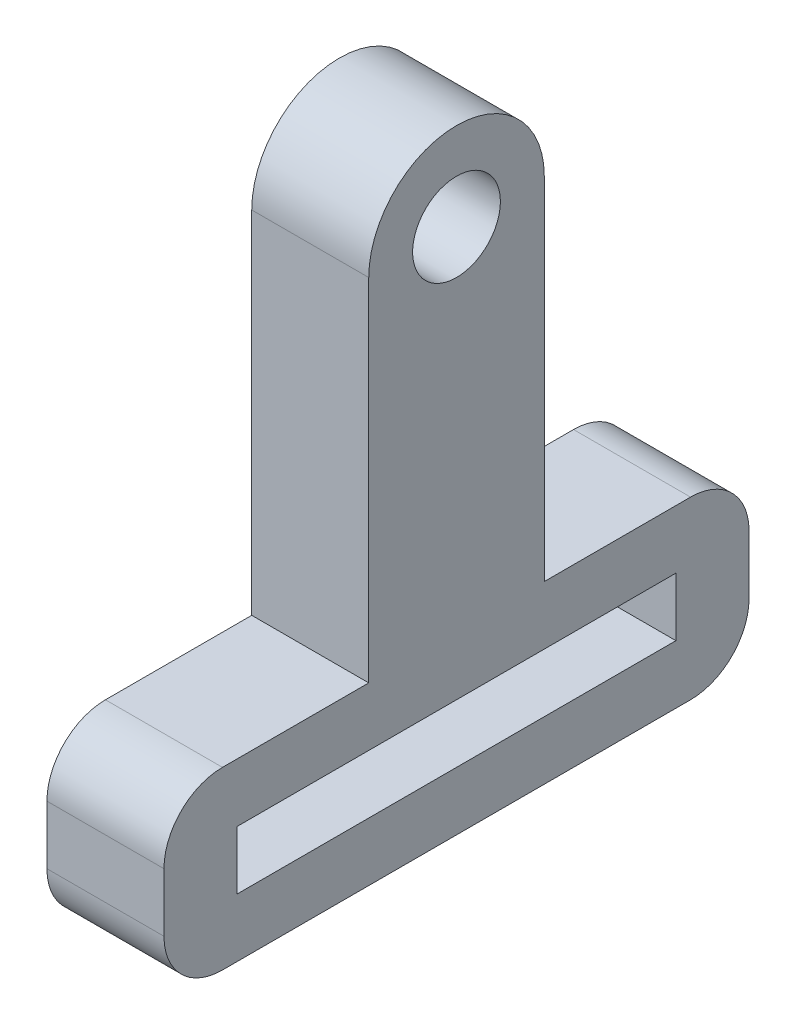
ISO-10303-21;
HEADER;
FILE_DESCRIPTION(('STEP AP214'),'2;1');
FILE_NAME('part.step','',(''),(''),'','','');
FILE_SCHEMA(('AUTOMOTIVE_DESIGN { 1 0 10303 214 1 1 1 1 }'));
ENDSEC;
DATA;
#1=APPLICATION_CONTEXT('core data for automotive mechanical design processes');
#2=APPLICATION_PROTOCOL_DEFINITION('international standard','automotive_design',2000,#1);
#3=PRODUCT_CONTEXT('',#1,'mechanical');
#4=PRODUCT('Part','Part','',(#3));
#5=PRODUCT_RELATED_PRODUCT_CATEGORY('part','',(#4));
#6=PRODUCT_DEFINITION_FORMATION('','',#4);
#7=PRODUCT_DEFINITION_CONTEXT('part definition',#1,'design');
#8=PRODUCT_DEFINITION('design','',#6,#7);
#9=PRODUCT_DEFINITION_SHAPE('','',#8);
#10=(LENGTH_UNIT() NAMED_UNIT(*) SI_UNIT(.MILLI.,.METRE.));
#11=(NAMED_UNIT(*) PLANE_ANGLE_UNIT() SI_UNIT($,.RADIAN.));
#12=(NAMED_UNIT(*) SI_UNIT($,.STERADIAN.) SOLID_ANGLE_UNIT());
#13=UNCERTAINTY_MEASURE_WITH_UNIT(LENGTH_MEASURE(1.E-05),#10,'distance_accuracy_value','');
#14=(GEOMETRIC_REPRESENTATION_CONTEXT(3) GLOBAL_UNCERTAINTY_ASSIGNED_CONTEXT((#13)) GLOBAL_UNIT_ASSIGNED_CONTEXT((#10,
#11,#12)) REPRESENTATION_CONTEXT('',''));
#15=CARTESIAN_POINT('',(0.,0.,0.));
#16=DIRECTION('',(0.,0.,1.));
#17=DIRECTION('',(1.,0.,0.));
#18=AXIS2_PLACEMENT_3D('',#15,#16,#17);
#19=CARTESIAN_POINT('',(2.,-1.,-8.));
#20=DIRECTION('',(1.,0.,0.));
#21=DIRECTION('',(0.,0.,-1.));
#22=AXIS2_PLACEMENT_3D('',#19,#20,#21);
#23=PLANE('',#22);
#24=DIRECTION('',(0.,0.,1.));
#25=VECTOR('',#24,1.);
#26=CARTESIAN_POINT('',(2.,1.,7.5));
#27=LINE('',#26,#25);
#28=CARTESIAN_POINT('',(2.,1.,-7.5));
#29=VERTEX_POINT('',#28);
#30=CARTESIAN_POINT('',(2.,1.,7.5));
#31=VERTEX_POINT('',#30);
#32=EDGE_CURVE('E154',#29,#31,#27,.T.);
#33=ORIENTED_EDGE('',*,*,#32,.F.);
#34=DIRECTION('',(0.,1.,0.));
#35=VECTOR('',#34,1.);
#36=CARTESIAN_POINT('',(2.,1.,-7.5));
#37=LINE('',#36,#35);
#38=CARTESIAN_POINT('',(2.,-1.,-7.5));
#39=VERTEX_POINT('',#38);
#40=EDGE_CURVE('E146',#39,#29,#37,.T.);
#41=ORIENTED_EDGE('',*,*,#40,.F.);
#42=DIRECTION('',(0.,0.,-1.));
#43=VECTOR('',#42,1.);
#44=CARTESIAN_POINT('',(2.,-1.,7.5));
#45=LINE('',#44,#43);
#46=CARTESIAN_POINT('',(2.,-1.,7.5));
#47=VERTEX_POINT('',#46);
#48=EDGE_CURVE('E169',#47,#39,#45,.T.);
#49=ORIENTED_EDGE('',*,*,#48,.F.);
#50=DIRECTION('',(0.,-1.,0.));
#51=VECTOR('',#50,1.);
#52=CARTESIAN_POINT('',(2.,1.,7.5));
#53=LINE('',#52,#51);
#54=EDGE_CURVE('E167',#31,#47,#53,.T.);
#55=ORIENTED_EDGE('',*,*,#54,.F.);
#56=EDGE_LOOP('',(#33,#41,#49,#55));
#57=FACE_BOUND('',#56,.T.);
#58=CARTESIAN_POINT('',(2.,-1.,-8.));
#59=DIRECTION('',(1.,0.,0.));
#60=DIRECTION('',(0.,0.,-1.));
#61=AXIS2_PLACEMENT_3D('',#58,#59,#60);
#62=CIRCLE('',#61,2.);
#63=CARTESIAN_POINT('',(2.,-3.,-7.99999999999998));
#64=VERTEX_POINT('',#63);
#65=CARTESIAN_POINT('',(2.,-0.999999999999986,-10.));
#66=VERTEX_POINT('',#65);
#67=EDGE_CURVE('E185',#64,#66,#62,.T.);
#68=ORIENTED_EDGE('',*,*,#67,.T.);
#69=DIRECTION('',(0.,1.,0.));
#70=VECTOR('',#69,1.);
#71=CARTESIAN_POINT('',(2.,0.999999999999986,-10.));
#72=LINE('',#71,#70);
#73=CARTESIAN_POINT('',(2.,0.999999999999987,-10.));
#74=VERTEX_POINT('',#73);
#75=EDGE_CURVE('E188',#66,#74,#72,.T.);
#76=ORIENTED_EDGE('',*,*,#75,.T.);
#77=CARTESIAN_POINT('',(2.,1.,-8.));
#78=DIRECTION('',(1.,0.,0.));
#79=DIRECTION('',(0.,0.,1.));
#80=AXIS2_PLACEMENT_3D('',#77,#78,#79);
#81=CIRCLE('',#80,2.);
#82=CARTESIAN_POINT('',(2.,3.,-7.99999999999998));
#83=VERTEX_POINT('',#82);
#84=EDGE_CURVE('E191',#74,#83,#81,.T.);
#85=ORIENTED_EDGE('',*,*,#84,.T.);
#86=DIRECTION('',(0.,0.,1.));
#87=VECTOR('',#86,1.);
#88=CARTESIAN_POINT('',(2.,3.,-3.));
#89=LINE('',#88,#87);
#90=CARTESIAN_POINT('',(2.,3.,-3.));
#91=VERTEX_POINT('',#90);
#92=EDGE_CURVE('E193',#83,#91,#89,.T.);
#93=ORIENTED_EDGE('',*,*,#92,.T.);
#94=DIRECTION('',(0.,1.,0.));
#95=VECTOR('',#94,1.);
#96=CARTESIAN_POINT('',(2.,15.,-3.));
#97=LINE('',#96,#95);
#98=CARTESIAN_POINT('',(2.,15.,-3.));
#99=VERTEX_POINT('',#98);
#100=EDGE_CURVE('E195',#91,#99,#97,.T.);
#101=ORIENTED_EDGE('',*,*,#100,.T.);
#102=CARTESIAN_POINT('',(2.,15.,0.));
#103=DIRECTION('',(1.,0.,0.));
#104=DIRECTION('',(0.,0.,-1.));
#105=AXIS2_PLACEMENT_3D('',#102,#103,#104);
#106=CIRCLE('',#105,3.);
#107=CARTESIAN_POINT('',(2.,15.,3.));
#108=VERTEX_POINT('',#107);
#109=EDGE_CURVE('E197',#99,#108,#106,.T.);
#110=ORIENTED_EDGE('',*,*,#109,.T.);
#111=DIRECTION('',(0.,-1.,0.));
#112=VECTOR('',#111,1.);
#113=CARTESIAN_POINT('',(2.,15.,3.));
#114=LINE('',#113,#112);
#115=CARTESIAN_POINT('',(2.,3.,3.));
#116=VERTEX_POINT('',#115);
#117=EDGE_CURVE('E199',#108,#116,#114,.T.);
#118=ORIENTED_EDGE('',*,*,#117,.T.);
#119=DIRECTION('',(0.,0.,1.));
#120=VECTOR('',#119,1.);
#121=CARTESIAN_POINT('',(2.,3.,3.));
#122=LINE('',#121,#120);
#123=CARTESIAN_POINT('',(2.,3.,7.99999999999999));
#124=VERTEX_POINT('',#123);
#125=EDGE_CURVE('E201',#116,#124,#122,.T.);
#126=ORIENTED_EDGE('',*,*,#125,.T.);
#127=CARTESIAN_POINT('',(2.,1.,8.));
#128=DIRECTION('',(1.,0.,0.));
#129=DIRECTION('',(0.,0.,-1.));
#130=AXIS2_PLACEMENT_3D('',#127,#128,#129);
#131=CIRCLE('',#130,2.);
#132=CARTESIAN_POINT('',(2.,0.999999999999986,10.));
#133=VERTEX_POINT('',#132);
#134=EDGE_CURVE('E203',#124,#133,#131,.T.);
#135=ORIENTED_EDGE('',*,*,#134,.T.);
#136=DIRECTION('',(0.,-1.,0.));
#137=VECTOR('',#136,1.);
#138=CARTESIAN_POINT('',(2.,0.999999999999986,10.));
#139=LINE('',#138,#137);
#140=CARTESIAN_POINT('',(2.,-0.999999999999986,10.));
#141=VERTEX_POINT('',#140);
#142=EDGE_CURVE('E205',#133,#141,#139,.T.);
#143=ORIENTED_EDGE('',*,*,#142,.T.);
#144=CARTESIAN_POINT('',(2.,-1.,8.));
#145=DIRECTION('',(1.,0.,0.));
#146=DIRECTION('',(0.,0.,-1.));
#147=AXIS2_PLACEMENT_3D('',#144,#145,#146);
#148=CIRCLE('',#147,2.);
#149=CARTESIAN_POINT('',(2.,-3.,7.99999999999999));
#150=VERTEX_POINT('',#149);
#151=EDGE_CURVE('E207',#141,#150,#148,.T.);
#152=ORIENTED_EDGE('',*,*,#151,.T.);
#153=DIRECTION('',(0.,0.,-1.));
#154=VECTOR('',#153,1.);
#155=CARTESIAN_POINT('',(2.,-3.,7.99999999999999));
#156=LINE('',#155,#154);
#157=EDGE_CURVE('E209',#150,#64,#156,.T.);
#158=ORIENTED_EDGE('',*,*,#157,.T.);
#159=EDGE_LOOP('',(#68,#76,#85,#93,#101,#110,#118,#126,#135,#143,#152,#158));
#160=FACE_BOUND('',#159,.T.);
#161=CARTESIAN_POINT('',(2.,15.,0.));
#162=DIRECTION('',(1.,0.,0.));
#163=DIRECTION('',(0.,0.,-1.));
#164=AXIS2_PLACEMENT_3D('',#161,#162,#163);
#165=CIRCLE('',#164,1.5);
#166=CARTESIAN_POINT('',(2.,15.,-1.5));
#167=VERTEX_POINT('',#166);
#168=EDGE_CURVE('E175',#167,#167,#165,.T.);
#169=ORIENTED_EDGE('',*,*,#168,.F.);
#170=EDGE_LOOP('',(#169));
#171=FACE_BOUND('',#170,.T.);
#172=ADVANCED_FACE('F33',(#57,#160,#171),#23,.T.);
#173=CARTESIAN_POINT('',(-2.,-1.,-8.));
#174=DIRECTION('',(1.,0.,0.));
#175=DIRECTION('',(0.,0.,-1.));
#176=AXIS2_PLACEMENT_3D('',#173,#174,#175);
#177=PLANE('',#176);
#178=CARTESIAN_POINT('',(-2.,-1.,-8.));
#179=DIRECTION('',(1.,0.,0.));
#180=DIRECTION('',(0.,0.,-1.));
#181=AXIS2_PLACEMENT_3D('',#178,#179,#180);
#182=CIRCLE('',#181,2.);
#183=CARTESIAN_POINT('',(-2.,-3.,-7.99999999999998));
#184=VERTEX_POINT('',#183);
#185=CARTESIAN_POINT('',(-2.,-0.999999999999986,-10.));
#186=VERTEX_POINT('',#185);
#187=EDGE_CURVE('E162',#184,#186,#182,.T.);
#188=ORIENTED_EDGE('',*,*,#187,.F.);
#189=DIRECTION('',(0.,0.,-1.));
#190=VECTOR('',#189,1.);
#191=CARTESIAN_POINT('',(-2.,-3.,7.99999999999999));
#192=LINE('',#191,#190);
#193=CARTESIAN_POINT('',(-2.,-3.,7.99999999999999));
#194=VERTEX_POINT('',#193);
#195=EDGE_CURVE('E189',#194,#184,#192,.T.);
#196=ORIENTED_EDGE('',*,*,#195,.F.);
#197=CARTESIAN_POINT('',(-2.,-1.,8.));
#198=DIRECTION('',(1.,0.,0.));
#199=DIRECTION('',(0.,0.,-1.));
#200=AXIS2_PLACEMENT_3D('',#197,#198,#199);
#201=CIRCLE('',#200,2.);
#202=CARTESIAN_POINT('',(-2.,-0.999999999999986,10.));
#203=VERTEX_POINT('',#202);
#204=EDGE_CURVE('E232',#203,#194,#201,.T.);
#205=ORIENTED_EDGE('',*,*,#204,.F.);
#206=DIRECTION('',(0.,-1.,0.));
#207=VECTOR('',#206,1.);
#208=CARTESIAN_POINT('',(-2.,0.999999999999986,10.));
#209=LINE('',#208,#207);
#210=CARTESIAN_POINT('',(-2.,0.999999999999986,10.));
#211=VERTEX_POINT('',#210);
#212=EDGE_CURVE('E230',#211,#203,#209,.T.);
#213=ORIENTED_EDGE('',*,*,#212,.F.);
#214=CARTESIAN_POINT('',(-2.,1.,8.));
#215=DIRECTION('',(1.,0.,0.));
#216=DIRECTION('',(0.,0.,-1.));
#217=AXIS2_PLACEMENT_3D('',#214,#215,#216);
#218=CIRCLE('',#217,2.);
#219=CARTESIAN_POINT('',(-2.,3.,7.99999999999999));
#220=VERTEX_POINT('',#219);
#221=EDGE_CURVE('E228',#220,#211,#218,.T.);
#222=ORIENTED_EDGE('',*,*,#221,.F.);
#223=DIRECTION('',(0.,0.,1.));
#224=VECTOR('',#223,1.);
#225=CARTESIAN_POINT('',(-2.,3.,3.));
#226=LINE('',#225,#224);
#227=CARTESIAN_POINT('',(-2.,3.,3.));
#228=VERTEX_POINT('',#227);
#229=EDGE_CURVE('E226',#228,#220,#226,.T.);
#230=ORIENTED_EDGE('',*,*,#229,.F.);
#231=DIRECTION('',(0.,-1.,0.));
#232=VECTOR('',#231,1.);
#233=CARTESIAN_POINT('',(-2.,15.,3.));
#234=LINE('',#233,#232);
#235=CARTESIAN_POINT('',(-2.,15.,3.));
#236=VERTEX_POINT('',#235);
#237=EDGE_CURVE('E224',#236,#228,#234,.T.);
#238=ORIENTED_EDGE('',*,*,#237,.F.);
#239=CARTESIAN_POINT('',(-2.,15.,0.));
#240=DIRECTION('',(1.,0.,0.));
#241=DIRECTION('',(0.,0.,-1.));
#242=AXIS2_PLACEMENT_3D('',#239,#240,#241);
#243=CIRCLE('',#242,3.);
#244=CARTESIAN_POINT('',(-2.,15.,-3.));
#245=VERTEX_POINT('',#244);
#246=EDGE_CURVE('E222',#245,#236,#243,.T.);
#247=ORIENTED_EDGE('',*,*,#246,.F.);
#248=DIRECTION('',(0.,1.,0.));
#249=VECTOR('',#248,1.);
#250=CARTESIAN_POINT('',(-2.,15.,-3.));
#251=LINE('',#250,#249);
#252=CARTESIAN_POINT('',(-2.,3.,-3.));
#253=VERTEX_POINT('',#252);
#254=EDGE_CURVE('E220',#253,#245,#251,.T.);
#255=ORIENTED_EDGE('',*,*,#254,.F.);
#256=DIRECTION('',(0.,0.,1.));
#257=VECTOR('',#256,1.);
#258=CARTESIAN_POINT('',(-2.,3.,-3.));
#259=LINE('',#258,#257);
#260=CARTESIAN_POINT('',(-2.,3.,-7.99999999999998));
#261=VERTEX_POINT('',#260);
#262=EDGE_CURVE('E218',#261,#253,#259,.T.);
#263=ORIENTED_EDGE('',*,*,#262,.F.);
#264=CARTESIAN_POINT('',(-2.,1.,-8.));
#265=DIRECTION('',(1.,0.,0.));
#266=DIRECTION('',(0.,0.,1.));
#267=AXIS2_PLACEMENT_3D('',#264,#265,#266);
#268=CIRCLE('',#267,2.);
#269=CARTESIAN_POINT('',(-2.,0.999999999999987,-10.));
#270=VERTEX_POINT('',#269);
#271=EDGE_CURVE('E216',#270,#261,#268,.T.);
#272=ORIENTED_EDGE('',*,*,#271,.F.);
#273=DIRECTION('',(0.,1.,0.));
#274=VECTOR('',#273,1.);
#275=CARTESIAN_POINT('',(-2.,0.999999999999986,-10.));
#276=LINE('',#275,#274);
#277=EDGE_CURVE('E214',#186,#270,#276,.T.);
#278=ORIENTED_EDGE('',*,*,#277,.F.);
#279=EDGE_LOOP('',(#188,#196,#205,#213,#222,#230,#238,#247,#255,#263,#272,#278));
#280=FACE_BOUND('',#279,.T.);
#281=DIRECTION('',(0.,1.,0.));
#282=VECTOR('',#281,1.);
#283=CARTESIAN_POINT('',(-2.,1.,-7.5));
#284=LINE('',#283,#282);
#285=CARTESIAN_POINT('',(-2.,-1.,-7.5));
#286=VERTEX_POINT('',#285);
#287=CARTESIAN_POINT('',(-2.,1.,-7.5));
#288=VERTEX_POINT('',#287);
#289=EDGE_CURVE('E56',#286,#288,#284,.T.);
#290=ORIENTED_EDGE('',*,*,#289,.T.);
#291=DIRECTION('',(0.,0.,1.));
#292=VECTOR('',#291,1.);
#293=CARTESIAN_POINT('',(-2.,1.,7.5));
#294=LINE('',#293,#292);
#295=CARTESIAN_POINT('',(-2.,1.,7.5));
#296=VERTEX_POINT('',#295);
#297=EDGE_CURVE('E161',#288,#296,#294,.T.);
#298=ORIENTED_EDGE('',*,*,#297,.T.);
#299=DIRECTION('',(0.,-1.,0.));
#300=VECTOR('',#299,1.);
#301=CARTESIAN_POINT('',(-2.,1.,7.5));
#302=LINE('',#301,#300);
#303=CARTESIAN_POINT('',(-2.,-1.,7.5));
#304=VERTEX_POINT('',#303);
#305=EDGE_CURVE('E177',#296,#304,#302,.T.);
#306=ORIENTED_EDGE('',*,*,#305,.T.);
#307=DIRECTION('',(0.,0.,-1.));
#308=VECTOR('',#307,1.);
#309=CARTESIAN_POINT('',(-2.,-1.,7.5));
#310=LINE('',#309,#308);
#311=EDGE_CURVE('E155',#304,#286,#310,.T.);
#312=ORIENTED_EDGE('',*,*,#311,.T.);
#313=EDGE_LOOP('',(#290,#298,#306,#312));
#314=FACE_BOUND('',#313,.T.);
#315=CARTESIAN_POINT('',(-2.,15.,0.));
#316=DIRECTION('',(1.,0.,0.));
#317=DIRECTION('',(0.,0.,-1.));
#318=AXIS2_PLACEMENT_3D('',#315,#316,#317);
#319=CIRCLE('',#318,1.5);
#320=CARTESIAN_POINT('',(-2.,15.,-1.5));
#321=VERTEX_POINT('',#320);
#322=EDGE_CURVE('E485',#321,#321,#319,.T.);
#323=ORIENTED_EDGE('',*,*,#322,.T.);
#324=EDGE_LOOP('',(#323));
#325=FACE_BOUND('',#324,.T.);
#326=ADVANCED_FACE('F274',(#280,#314,#325),#177,.F.);
#327=CARTESIAN_POINT('',(2.,-1.,-8.));
#328=DIRECTION('',(-1.,0.,0.));
#329=DIRECTION('',(0.,0.,1.));
#330=AXIS2_PLACEMENT_3D('',#327,#328,#329);
#331=CYLINDRICAL_SURFACE('',#330,2.);
#332=ORIENTED_EDGE('',*,*,#187,.T.);
#333=DIRECTION('',(-1.,0.,0.));
#334=VECTOR('',#333,1.);
#335=CARTESIAN_POINT('',(2.,-0.999999999999986,-10.));
#336=LINE('',#335,#334);
#337=EDGE_CURVE('E11',#66,#186,#336,.T.);
#338=ORIENTED_EDGE('',*,*,#337,.F.);
#339=ORIENTED_EDGE('',*,*,#67,.F.);
#340=DIRECTION('',(-1.,0.,0.));
#341=VECTOR('',#340,1.);
#342=CARTESIAN_POINT('',(2.,-3.,-7.99999999999998));
#343=LINE('',#342,#341);
#344=EDGE_CURVE('E211',#64,#184,#343,.T.);
#345=ORIENTED_EDGE('',*,*,#344,.T.);
#346=EDGE_LOOP('',(#332,#338,#339,#345));
#347=FACE_BOUND('',#346,.T.);
#348=ADVANCED_FACE('F35',(#347),#331,.T.);
#349=CARTESIAN_POINT('',(2.,0.999999999999986,-10.));
#350=DIRECTION('',(0.,0.,1.));
#351=DIRECTION('',(1.,0.,0.));
#352=AXIS2_PLACEMENT_3D('',#349,#350,#351);
#353=PLANE('',#352);
#354=ORIENTED_EDGE('',*,*,#277,.T.);
#355=DIRECTION('',(-1.,0.,0.));
#356=VECTOR('',#355,1.);
#357=CARTESIAN_POINT('',(2.,0.999999999999987,-10.));
#358=LINE('',#357,#356);
#359=EDGE_CURVE('E41',#74,#270,#358,.T.);
#360=ORIENTED_EDGE('',*,*,#359,.F.);
#361=ORIENTED_EDGE('',*,*,#75,.F.);
#362=ORIENTED_EDGE('',*,*,#337,.T.);
#363=EDGE_LOOP('',(#354,#360,#361,#362));
#364=FACE_BOUND('',#363,.T.);
#365=ADVANCED_FACE('F291',(#364),#353,.F.);
#366=CARTESIAN_POINT('',(2.,1.,-8.));
#367=DIRECTION('',(-1.,0.,0.));
#368=DIRECTION('',(0.,0.,1.));
#369=AXIS2_PLACEMENT_3D('',#366,#367,#368);
#370=CYLINDRICAL_SURFACE('',#369,2.);
#371=ORIENTED_EDGE('',*,*,#271,.T.);
#372=DIRECTION('',(-1.,0.,0.));
#373=VECTOR('',#372,1.);
#374=CARTESIAN_POINT('',(2.,3.,-7.99999999999998));
#375=LINE('',#374,#373);
#376=EDGE_CURVE('E261',#83,#261,#375,.T.);
#377=ORIENTED_EDGE('',*,*,#376,.F.);
#378=ORIENTED_EDGE('',*,*,#84,.F.);
#379=ORIENTED_EDGE('',*,*,#359,.T.);
#380=EDGE_LOOP('',(#371,#377,#378,#379));
#381=FACE_BOUND('',#380,.T.);
#382=ADVANCED_FACE('F268',(#381),#370,.T.);
#383=CARTESIAN_POINT('',(2.,3.,-3.));
#384=DIRECTION('',(0.,-1.,0.));
#385=DIRECTION('',(0.,0.,-1.));
#386=AXIS2_PLACEMENT_3D('',#383,#384,#385);
#387=PLANE('',#386);
#388=ORIENTED_EDGE('',*,*,#262,.T.);
#389=DIRECTION('',(-1.,0.,0.));
#390=VECTOR('',#389,1.);
#391=CARTESIAN_POINT('',(2.,3.,-3.));
#392=LINE('',#391,#390);
#393=EDGE_CURVE('E258',#91,#253,#392,.T.);
#394=ORIENTED_EDGE('',*,*,#393,.F.);
#395=ORIENTED_EDGE('',*,*,#92,.F.);
#396=ORIENTED_EDGE('',*,*,#376,.T.);
#397=EDGE_LOOP('',(#388,#394,#395,#396));
#398=FACE_BOUND('',#397,.T.);
#399=ADVANCED_FACE('F280',(#398),#387,.F.);
#400=CARTESIAN_POINT('',(2.,15.,-3.));
#401=DIRECTION('',(0.,0.,1.));
#402=DIRECTION('',(0.,-1.,0.));
#403=AXIS2_PLACEMENT_3D('',#400,#401,#402);
#404=PLANE('',#403);
#405=ORIENTED_EDGE('',*,*,#254,.T.);
#406=DIRECTION('',(-1.,0.,0.));
#407=VECTOR('',#406,1.);
#408=CARTESIAN_POINT('',(2.,15.,-3.));
#409=LINE('',#408,#407);
#410=EDGE_CURVE('E255',#99,#245,#409,.T.);
#411=ORIENTED_EDGE('',*,*,#410,.F.);
#412=ORIENTED_EDGE('',*,*,#100,.F.);
#413=ORIENTED_EDGE('',*,*,#393,.T.);
#414=EDGE_LOOP('',(#405,#411,#412,#413));
#415=FACE_BOUND('',#414,.T.);
#416=ADVANCED_FACE('F284',(#415),#404,.F.);
#417=CARTESIAN_POINT('',(2.,15.,0.));
#418=DIRECTION('',(-1.,0.,0.));
#419=DIRECTION('',(0.,0.,1.));
#420=AXIS2_PLACEMENT_3D('',#417,#418,#419);
#421=CYLINDRICAL_SURFACE('',#420,3.);
#422=ORIENTED_EDGE('',*,*,#246,.T.);
#423=DIRECTION('',(-1.,0.,0.));
#424=VECTOR('',#423,1.);
#425=CARTESIAN_POINT('',(2.,15.,3.));
#426=LINE('',#425,#424);
#427=EDGE_CURVE('E252',#108,#236,#426,.T.);
#428=ORIENTED_EDGE('',*,*,#427,.F.);
#429=ORIENTED_EDGE('',*,*,#109,.F.);
#430=ORIENTED_EDGE('',*,*,#410,.T.);
#431=EDGE_LOOP('',(#422,#428,#429,#430));
#432=FACE_BOUND('',#431,.T.);
#433=ADVANCED_FACE('F324',(#432),#421,.T.);
#434=CARTESIAN_POINT('',(2.,15.,3.));
#435=DIRECTION('',(0.,0.,-1.));
#436=DIRECTION('',(-1.,0.,0.));
#437=AXIS2_PLACEMENT_3D('',#434,#435,#436);
#438=PLANE('',#437);
#439=ORIENTED_EDGE('',*,*,#237,.T.);
#440=DIRECTION('',(-1.,0.,0.));
#441=VECTOR('',#440,1.);
#442=CARTESIAN_POINT('',(2.,3.,3.));
#443=LINE('',#442,#441);
#444=EDGE_CURVE('E249',#116,#228,#443,.T.);
#445=ORIENTED_EDGE('',*,*,#444,.F.);
#446=ORIENTED_EDGE('',*,*,#117,.F.);
#447=ORIENTED_EDGE('',*,*,#427,.T.);
#448=EDGE_LOOP('',(#439,#445,#446,#447));
#449=FACE_BOUND('',#448,.T.);
#450=ADVANCED_FACE('F322',(#449),#438,.F.);
#451=CARTESIAN_POINT('',(2.,3.,3.));
#452=DIRECTION('',(0.,-1.,0.));
#453=DIRECTION('',(0.,0.,-1.));
#454=AXIS2_PLACEMENT_3D('',#451,#452,#453);
#455=PLANE('',#454);
#456=ORIENTED_EDGE('',*,*,#229,.T.);
#457=DIRECTION('',(-1.,0.,0.));
#458=VECTOR('',#457,1.);
#459=CARTESIAN_POINT('',(2.,3.,7.99999999999999));
#460=LINE('',#459,#458);
#461=EDGE_CURVE('E246',#124,#220,#460,.T.);
#462=ORIENTED_EDGE('',*,*,#461,.F.);
#463=ORIENTED_EDGE('',*,*,#125,.F.);
#464=ORIENTED_EDGE('',*,*,#444,.T.);
#465=EDGE_LOOP('',(#456,#462,#463,#464));
#466=FACE_BOUND('',#465,.T.);
#467=ADVANCED_FACE('F318',(#466),#455,.F.);
#468=CARTESIAN_POINT('',(2.,1.,8.));
#469=DIRECTION('',(-1.,0.,0.));
#470=DIRECTION('',(0.,0.,1.));
#471=AXIS2_PLACEMENT_3D('',#468,#469,#470);
#472=CYLINDRICAL_SURFACE('',#471,2.);
#473=ORIENTED_EDGE('',*,*,#221,.T.);
#474=DIRECTION('',(-1.,0.,0.));
#475=VECTOR('',#474,1.);
#476=CARTESIAN_POINT('',(2.,0.999999999999986,10.));
#477=LINE('',#476,#475);
#478=EDGE_CURVE('E243',#133,#211,#477,.T.);
#479=ORIENTED_EDGE('',*,*,#478,.F.);
#480=ORIENTED_EDGE('',*,*,#134,.F.);
#481=ORIENTED_EDGE('',*,*,#461,.T.);
#482=EDGE_LOOP('',(#473,#479,#480,#481));
#483=FACE_BOUND('',#482,.T.);
#484=ADVANCED_FACE('F313',(#483),#472,.T.);
#485=CARTESIAN_POINT('',(2.,0.999999999999986,10.));
#486=DIRECTION('',(0.,0.,-1.));
#487=DIRECTION('',(-1.,0.,0.));
#488=AXIS2_PLACEMENT_3D('',#485,#486,#487);
#489=PLANE('',#488);
#490=ORIENTED_EDGE('',*,*,#212,.T.);
#491=DIRECTION('',(-1.,0.,0.));
#492=VECTOR('',#491,1.);
#493=CARTESIAN_POINT('',(2.,-0.999999999999986,10.));
#494=LINE('',#493,#492);
#495=EDGE_CURVE('E240',#141,#203,#494,.T.);
#496=ORIENTED_EDGE('',*,*,#495,.F.);
#497=ORIENTED_EDGE('',*,*,#142,.F.);
#498=ORIENTED_EDGE('',*,*,#478,.T.);
#499=EDGE_LOOP('',(#490,#496,#497,#498));
#500=FACE_BOUND('',#499,.T.);
#501=ADVANCED_FACE('F307',(#500),#489,.F.);
#502=CARTESIAN_POINT('',(2.,-1.,8.));
#503=DIRECTION('',(-1.,0.,0.));
#504=DIRECTION('',(0.,0.,1.));
#505=AXIS2_PLACEMENT_3D('',#502,#503,#504);
#506=CYLINDRICAL_SURFACE('',#505,2.);
#507=ORIENTED_EDGE('',*,*,#204,.T.);
#508=DIRECTION('',(-1.,0.,0.));
#509=VECTOR('',#508,1.);
#510=CARTESIAN_POINT('',(2.,-3.,7.99999999999999));
#511=LINE('',#510,#509);
#512=EDGE_CURVE('E237',#150,#194,#511,.T.);
#513=ORIENTED_EDGE('',*,*,#512,.F.);
#514=ORIENTED_EDGE('',*,*,#151,.F.);
#515=ORIENTED_EDGE('',*,*,#495,.T.);
#516=EDGE_LOOP('',(#507,#513,#514,#515));
#517=FACE_BOUND('',#516,.T.);
#518=ADVANCED_FACE('F303',(#517),#506,.T.);
#519=CARTESIAN_POINT('',(2.,-3.,7.99999999999999));
#520=DIRECTION('',(0.,1.,0.));
#521=DIRECTION('',(0.,0.,1.));
#522=AXIS2_PLACEMENT_3D('',#519,#520,#521);
#523=PLANE('',#522);
#524=ORIENTED_EDGE('',*,*,#195,.T.);
#525=ORIENTED_EDGE('',*,*,#344,.F.);
#526=ORIENTED_EDGE('',*,*,#157,.F.);
#527=ORIENTED_EDGE('',*,*,#512,.T.);
#528=EDGE_LOOP('',(#524,#525,#526,#527));
#529=FACE_BOUND('',#528,.T.);
#530=ADVANCED_FACE('F298',(#529),#523,.F.);
#531=CARTESIAN_POINT('',(2.,1.,-7.5));
#532=DIRECTION('',(0.,0.,1.));
#533=DIRECTION('',(1.,0.,0.));
#534=AXIS2_PLACEMENT_3D('',#531,#532,#533);
#535=PLANE('',#534);
#536=ORIENTED_EDGE('',*,*,#289,.F.);
#537=DIRECTION('',(-1.,0.,0.));
#538=VECTOR('',#537,1.);
#539=CARTESIAN_POINT('',(2.,-1.,-7.5));
#540=LINE('',#539,#538);
#541=EDGE_CURVE('E150',#39,#286,#540,.T.);
#542=ORIENTED_EDGE('',*,*,#541,.F.);
#543=ORIENTED_EDGE('',*,*,#40,.T.);
#544=DIRECTION('',(-1.,0.,0.));
#545=VECTOR('',#544,1.);
#546=CARTESIAN_POINT('',(2.,1.,-7.5));
#547=LINE('',#546,#545);
#548=EDGE_CURVE('E149',#29,#288,#547,.T.);
#549=ORIENTED_EDGE('',*,*,#548,.T.);
#550=EDGE_LOOP('',(#536,#542,#543,#549));
#551=FACE_BOUND('',#550,.T.);
#552=ADVANCED_FACE('F148',(#551),#535,.T.);
#553=CARTESIAN_POINT('',(2.,1.,7.5));
#554=DIRECTION('',(0.,-1.,0.));
#555=DIRECTION('',(0.,0.,-1.));
#556=AXIS2_PLACEMENT_3D('',#553,#554,#555);
#557=PLANE('',#556);
#558=ORIENTED_EDGE('',*,*,#297,.F.);
#559=ORIENTED_EDGE('',*,*,#548,.F.);
#560=ORIENTED_EDGE('',*,*,#32,.T.);
#561=DIRECTION('',(-1.,0.,0.));
#562=VECTOR('',#561,1.);
#563=CARTESIAN_POINT('',(2.,1.,7.5));
#564=LINE('',#563,#562);
#565=EDGE_CURVE('E163',#31,#296,#564,.T.);
#566=ORIENTED_EDGE('',*,*,#565,.T.);
#567=EDGE_LOOP('',(#558,#559,#560,#566));
#568=FACE_BOUND('',#567,.T.);
#569=ADVANCED_FACE('F158',(#568),#557,.T.);
#570=CARTESIAN_POINT('',(2.,1.,7.5));
#571=DIRECTION('',(0.,0.,-1.));
#572=DIRECTION('',(-1.,0.,0.));
#573=AXIS2_PLACEMENT_3D('',#570,#571,#572);
#574=PLANE('',#573);
#575=ORIENTED_EDGE('',*,*,#305,.F.);
#576=ORIENTED_EDGE('',*,*,#565,.F.);
#577=ORIENTED_EDGE('',*,*,#54,.T.);
#578=DIRECTION('',(-1.,0.,0.));
#579=VECTOR('',#578,1.);
#580=CARTESIAN_POINT('',(2.,-1.,7.5));
#581=LINE('',#580,#579);
#582=EDGE_CURVE('E48',#47,#304,#581,.T.);
#583=ORIENTED_EDGE('',*,*,#582,.T.);
#584=EDGE_LOOP('',(#575,#576,#577,#583));
#585=FACE_BOUND('',#584,.T.);
#586=ADVANCED_FACE('F382',(#585),#574,.T.);
#587=CARTESIAN_POINT('',(2.,-1.,7.5));
#588=DIRECTION('',(0.,1.,0.));
#589=DIRECTION('',(0.,0.,1.));
#590=AXIS2_PLACEMENT_3D('',#587,#588,#589);
#591=PLANE('',#590);
#592=ORIENTED_EDGE('',*,*,#311,.F.);
#593=ORIENTED_EDGE('',*,*,#582,.F.);
#594=ORIENTED_EDGE('',*,*,#48,.T.);
#595=ORIENTED_EDGE('',*,*,#541,.T.);
#596=EDGE_LOOP('',(#592,#593,#594,#595));
#597=FACE_BOUND('',#596,.T.);
#598=ADVANCED_FACE('F388',(#597),#591,.T.);
#599=CARTESIAN_POINT('',(2.,15.,0.));
#600=DIRECTION('',(-1.,0.,0.));
#601=DIRECTION('',(0.,0.,1.));
#602=AXIS2_PLACEMENT_3D('',#599,#600,#601);
#603=CYLINDRICAL_SURFACE('',#602,1.5);
#604=ORIENTED_EDGE('',*,*,#168,.T.);
#605=EDGE_LOOP('',(#604));
#606=FACE_BOUND('',#605,.T.);
#607=ORIENTED_EDGE('',*,*,#322,.F.);
#608=EDGE_LOOP('',(#607));
#609=FACE_BOUND('',#608,.T.);
#610=ADVANCED_FACE('F396',(#606,#609),#603,.F.);
#611=CLOSED_SHELL('',(#172,#326,#348,#365,#382,#399,#416,#433,#450,#467,#484,#501,#518,#530,
#552,#569,#586,#598,#610));
#612=MANIFOLD_SOLID_BREP('B2',#611);
#613=ADVANCED_BREP_SHAPE_REPRESENTATION('',(#18,#612),#14);
#614=SHAPE_DEFINITION_REPRESENTATION(#9,#613);
ENDSEC;
END-ISO-10303-21;
